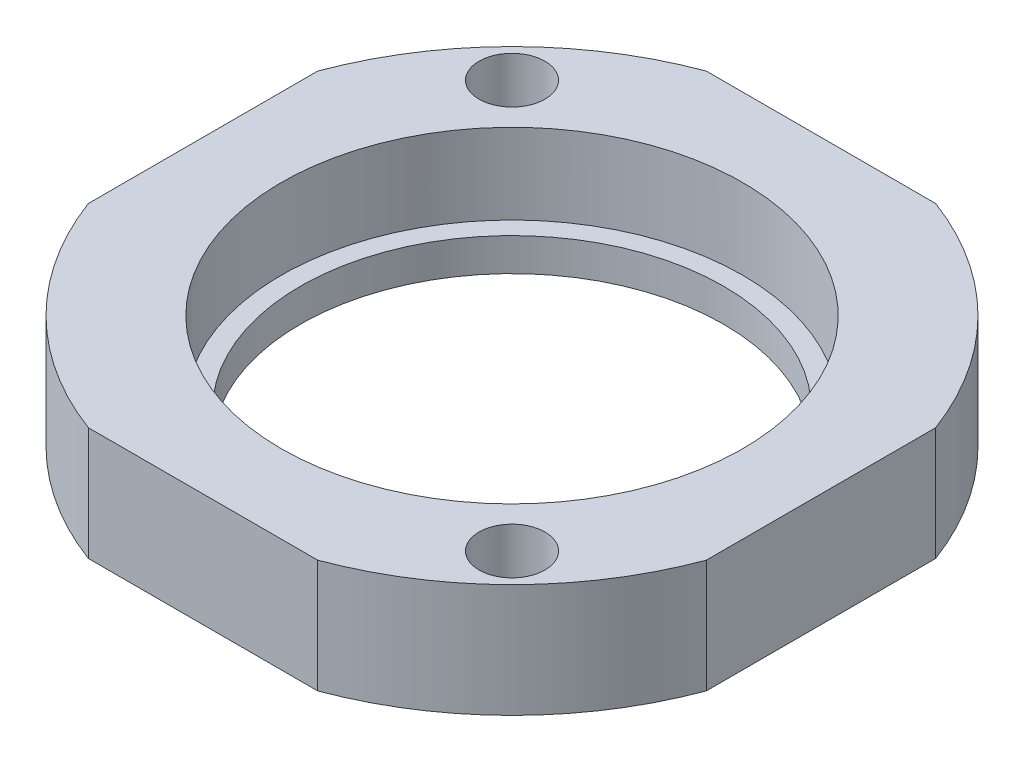
ISO-10303-21;
HEADER;
FILE_DESCRIPTION(('STEP AP214'),'2;1');
FILE_NAME('part.step','',(''),(''),'','','');
FILE_SCHEMA(('AUTOMOTIVE_DESIGN { 1 0 10303 214 1 1 1 1 }'));
ENDSEC;
DATA;
#1=APPLICATION_CONTEXT('core data for automotive mechanical design processes');
#2=APPLICATION_PROTOCOL_DEFINITION('international standard','automotive_design',2000,#1);
#3=PRODUCT_CONTEXT('',#1,'mechanical');
#4=PRODUCT('Part','Part','',(#3));
#5=PRODUCT_RELATED_PRODUCT_CATEGORY('part','',(#4));
#6=PRODUCT_DEFINITION_FORMATION('','',#4);
#7=PRODUCT_DEFINITION_CONTEXT('part definition',#1,'design');
#8=PRODUCT_DEFINITION('design','',#6,#7);
#9=PRODUCT_DEFINITION_SHAPE('','',#8);
#10=(LENGTH_UNIT() NAMED_UNIT(*) SI_UNIT(.MILLI.,.METRE.));
#11=(NAMED_UNIT(*) PLANE_ANGLE_UNIT() SI_UNIT($,.RADIAN.));
#12=(NAMED_UNIT(*) SI_UNIT($,.STERADIAN.) SOLID_ANGLE_UNIT());
#13=UNCERTAINTY_MEASURE_WITH_UNIT(LENGTH_MEASURE(1.E-05),#10,'distance_accuracy_value','');
#14=(GEOMETRIC_REPRESENTATION_CONTEXT(3) GLOBAL_UNCERTAINTY_ASSIGNED_CONTEXT((#13)) GLOBAL_UNIT_ASSIGNED_CONTEXT((#10,
#11,#12)) REPRESENTATION_CONTEXT('',''));
#15=CARTESIAN_POINT('',(0.,0.,0.));
#16=DIRECTION('',(0.,0.,1.));
#17=DIRECTION('',(1.,0.,0.));
#18=AXIS2_PLACEMENT_3D('',#15,#16,#17);
#19=CARTESIAN_POINT('',(0.,-5.5,0.));
#20=DIRECTION('',(0.,1.,0.));
#21=DIRECTION('',(0.,0.,1.));
#22=AXIS2_PLACEMENT_3D('',#19,#20,#21);
#23=CYLINDRICAL_SURFACE('',#22,11.2);
#24=CARTESIAN_POINT('',(0.,0.,0.));
#25=DIRECTION('',(0.,1.,0.));
#26=DIRECTION('',(0.,0.,1.));
#27=AXIS2_PLACEMENT_3D('',#24,#25,#26);
#28=CIRCLE('',#27,11.2);
#29=CARTESIAN_POINT('',(0.,0.,11.2));
#30=VERTEX_POINT('',#29);
#31=EDGE_CURVE('E146',#30,#30,#28,.T.);
#32=ORIENTED_EDGE('',*,*,#31,.T.);
#33=EDGE_LOOP('',(#32));
#34=FACE_BOUND('',#33,.T.);
#35=CARTESIAN_POINT('',(0.,-3.9,0.));
#36=DIRECTION('',(0.,-1.,0.));
#37=DIRECTION('',(0.,0.,-1.));
#38=AXIS2_PLACEMENT_3D('',#35,#36,#37);
#39=CIRCLE('',#38,11.2);
#40=CARTESIAN_POINT('',(0.,-3.9,-11.2));
#41=VERTEX_POINT('',#40);
#42=EDGE_CURVE('E11',#41,#41,#39,.F.);
#43=ORIENTED_EDGE('',*,*,#42,.F.);
#44=EDGE_LOOP('',(#43));
#45=FACE_BOUND('',#44,.T.);
#46=ADVANCED_FACE('F37',(#34,#45),#23,.F.);
#47=CARTESIAN_POINT('',(0.,-5.5,15.));
#48=DIRECTION('',(0.,0.,-1.));
#49=DIRECTION('',(-1.,0.,0.));
#50=AXIS2_PLACEMENT_3D('',#47,#48,#49);
#51=PLANE('',#50);
#52=DIRECTION('',(-1.,0.,0.));
#53=VECTOR('',#52,1.);
#54=CARTESIAN_POINT('',(0.,0.,15.));
#55=LINE('',#54,#53);
#56=CARTESIAN_POINT('',(5.56776436283002,0.,15.));
#57=VERTEX_POINT('',#56);
#58=CARTESIAN_POINT('',(-5.56776436283001,0.,15.));
#59=VERTEX_POINT('',#58);
#60=EDGE_CURVE('E149',#57,#59,#55,.T.);
#61=ORIENTED_EDGE('',*,*,#60,.T.);
#62=DIRECTION('',(0.,1.,0.));
#63=VECTOR('',#62,1.);
#64=CARTESIAN_POINT('',(-5.56776436283001,-5.5,15.));
#65=LINE('',#64,#63);
#66=CARTESIAN_POINT('',(-5.56776436283001,-5.5,15.));
#67=VERTEX_POINT('',#66);
#68=EDGE_CURVE('E46',#67,#59,#65,.T.);
#69=ORIENTED_EDGE('',*,*,#68,.F.);
#70=DIRECTION('',(-1.,0.,0.));
#71=VECTOR('',#70,1.);
#72=CARTESIAN_POINT('',(0.,-5.5,15.));
#73=LINE('',#72,#71);
#74=CARTESIAN_POINT('',(5.56776436283002,-5.5,15.));
#75=VERTEX_POINT('',#74);
#76=EDGE_CURVE('E54',#75,#67,#73,.T.);
#77=ORIENTED_EDGE('',*,*,#76,.F.);
#78=DIRECTION('',(0.,1.,0.));
#79=VECTOR('',#78,1.);
#80=CARTESIAN_POINT('',(5.56776436283002,-5.5,15.));
#81=LINE('',#80,#79);
#82=EDGE_CURVE('E97',#75,#57,#81,.T.);
#83=ORIENTED_EDGE('',*,*,#82,.T.);
#84=EDGE_LOOP('',(#61,#69,#77,#83));
#85=FACE_BOUND('',#84,.T.);
#86=ADVANCED_FACE('F39',(#85),#51,.F.);
#87=CARTESIAN_POINT('',(0.,-5.5,0.));
#88=DIRECTION('',(0.,1.,0.));
#89=DIRECTION('',(0.,0.,1.));
#90=AXIS2_PLACEMENT_3D('',#87,#88,#89);
#91=CYLINDRICAL_SURFACE('',#90,16.);
#92=CARTESIAN_POINT('',(0.,0.,0.));
#93=DIRECTION('',(0.,1.,0.));
#94=DIRECTION('',(0.,0.,1.));
#95=AXIS2_PLACEMENT_3D('',#92,#93,#94);
#96=CIRCLE('',#95,16.);
#97=CARTESIAN_POINT('',(-15.,0.,5.56776436283002));
#98=VERTEX_POINT('',#97);
#99=EDGE_CURVE('E140',#98,#59,#96,.T.);
#100=ORIENTED_EDGE('',*,*,#99,.F.);
#101=DIRECTION('',(0.,1.,0.));
#102=VECTOR('',#101,1.);
#103=CARTESIAN_POINT('',(-15.,-5.5,5.56776436283002));
#104=LINE('',#103,#102);
#105=CARTESIAN_POINT('',(-15.,-5.5,5.56776436283002));
#106=VERTEX_POINT('',#105);
#107=EDGE_CURVE('E83',#106,#98,#104,.T.);
#108=ORIENTED_EDGE('',*,*,#107,.F.);
#109=CARTESIAN_POINT('',(0.,-5.5,0.));
#110=DIRECTION('',(0.,1.,0.));
#111=DIRECTION('',(0.,0.,1.));
#112=AXIS2_PLACEMENT_3D('',#109,#110,#111);
#113=CIRCLE('',#112,16.);
#114=EDGE_CURVE('E127',#106,#67,#113,.T.);
#115=ORIENTED_EDGE('',*,*,#114,.T.);
#116=ORIENTED_EDGE('',*,*,#68,.T.);
#117=EDGE_LOOP('',(#100,#108,#115,#116));
#118=FACE_BOUND('',#117,.T.);
#119=ADVANCED_FACE('F193',(#118),#91,.T.);
#120=CARTESIAN_POINT('',(-15.,-5.5,0.));
#121=DIRECTION('',(-1.,0.,0.));
#122=DIRECTION('',(0.,0.,1.));
#123=AXIS2_PLACEMENT_3D('',#120,#121,#122);
#124=PLANE('',#123);
#125=DIRECTION('',(0.,0.,1.));
#126=VECTOR('',#125,1.);
#127=CARTESIAN_POINT('',(-15.,0.,0.));
#128=LINE('',#127,#126);
#129=CARTESIAN_POINT('',(-15.,0.,-5.56776436283002));
#130=VERTEX_POINT('',#129);
#131=EDGE_CURVE('E114',#130,#98,#128,.T.);
#132=ORIENTED_EDGE('',*,*,#131,.F.);
#133=DIRECTION('',(0.,1.,0.));
#134=VECTOR('',#133,1.);
#135=CARTESIAN_POINT('',(-15.,-5.5,-5.56776436283002));
#136=LINE('',#135,#134);
#137=CARTESIAN_POINT('',(-15.,-5.5,-5.56776436283002));
#138=VERTEX_POINT('',#137);
#139=EDGE_CURVE('E110',#138,#130,#136,.T.);
#140=ORIENTED_EDGE('',*,*,#139,.F.);
#141=DIRECTION('',(0.,0.,1.));
#142=VECTOR('',#141,1.);
#143=CARTESIAN_POINT('',(-15.,-5.5,0.));
#144=LINE('',#143,#142);
#145=EDGE_CURVE('E113',#138,#106,#144,.T.);
#146=ORIENTED_EDGE('',*,*,#145,.T.);
#147=ORIENTED_EDGE('',*,*,#107,.T.);
#148=EDGE_LOOP('',(#132,#140,#146,#147));
#149=FACE_BOUND('',#148,.T.);
#150=ADVANCED_FACE('F112',(#149),#124,.T.);
#151=CARTESIAN_POINT('',(-5.56776436283002,0.,-15.));
#152=VERTEX_POINT('',#151);
#153=EDGE_CURVE('E143',#152,#130,#96,.T.);
#154=ORIENTED_EDGE('',*,*,#153,.F.);
#155=DIRECTION('',(0.,1.,0.));
#156=VECTOR('',#155,1.);
#157=CARTESIAN_POINT('',(-5.56776436283002,-5.5,-15.));
#158=LINE('',#157,#156);
#159=CARTESIAN_POINT('',(-5.56776436283002,-5.5,-15.));
#160=VERTEX_POINT('',#159);
#161=EDGE_CURVE('E119',#160,#152,#158,.T.);
#162=ORIENTED_EDGE('',*,*,#161,.F.);
#163=EDGE_CURVE('E125',#160,#138,#113,.T.);
#164=ORIENTED_EDGE('',*,*,#163,.T.);
#165=ORIENTED_EDGE('',*,*,#139,.T.);
#166=EDGE_LOOP('',(#154,#162,#164,#165));
#167=FACE_BOUND('',#166,.T.);
#168=ADVANCED_FACE('F129',(#167),#91,.T.);
#169=CARTESIAN_POINT('',(0.,-5.5,-15.));
#170=DIRECTION('',(0.,0.,-1.));
#171=DIRECTION('',(-1.,0.,0.));
#172=AXIS2_PLACEMENT_3D('',#169,#170,#171);
#173=PLANE('',#172);
#174=DIRECTION('',(-1.,0.,0.));
#175=VECTOR('',#174,1.);
#176=CARTESIAN_POINT('',(0.,0.,-15.));
#177=LINE('',#176,#175);
#178=CARTESIAN_POINT('',(5.56776436283002,0.,-15.));
#179=VERTEX_POINT('',#178);
#180=EDGE_CURVE('E299',#179,#152,#177,.T.);
#181=ORIENTED_EDGE('',*,*,#180,.F.);
#182=DIRECTION('',(0.,1.,0.));
#183=VECTOR('',#182,1.);
#184=CARTESIAN_POINT('',(5.56776436283002,-5.5,-15.));
#185=LINE('',#184,#183);
#186=CARTESIAN_POINT('',(5.56776436283002,-5.5,-15.));
#187=VERTEX_POINT('',#186);
#188=EDGE_CURVE('E307',#187,#179,#185,.T.);
#189=ORIENTED_EDGE('',*,*,#188,.F.);
#190=DIRECTION('',(-1.,0.,0.));
#191=VECTOR('',#190,1.);
#192=CARTESIAN_POINT('',(0.,-5.5,-15.));
#193=LINE('',#192,#191);
#194=EDGE_CURVE('E130',#187,#160,#193,.T.);
#195=ORIENTED_EDGE('',*,*,#194,.T.);
#196=ORIENTED_EDGE('',*,*,#161,.T.);
#197=EDGE_LOOP('',(#181,#189,#195,#196));
#198=FACE_BOUND('',#197,.T.);
#199=ADVANCED_FACE('F253',(#198),#173,.T.);
#200=CARTESIAN_POINT('',(15.,0.,-5.56776436283004));
#201=VERTEX_POINT('',#200);
#202=EDGE_CURVE('E300',#201,#179,#96,.T.);
#203=ORIENTED_EDGE('',*,*,#202,.F.);
#204=DIRECTION('',(0.,1.,0.));
#205=VECTOR('',#204,1.);
#206=CARTESIAN_POINT('',(15.,-5.5,-5.56776436283004));
#207=LINE('',#206,#205);
#208=CARTESIAN_POINT('',(15.,-5.5,-5.56776436283004));
#209=VERTEX_POINT('',#208);
#210=EDGE_CURVE('E309',#209,#201,#207,.T.);
#211=ORIENTED_EDGE('',*,*,#210,.F.);
#212=EDGE_CURVE('E132',#209,#187,#113,.T.);
#213=ORIENTED_EDGE('',*,*,#212,.T.);
#214=ORIENTED_EDGE('',*,*,#188,.T.);
#215=EDGE_LOOP('',(#203,#211,#213,#214));
#216=FACE_BOUND('',#215,.T.);
#217=ADVANCED_FACE('F192',(#216),#91,.T.);
#218=CARTESIAN_POINT('',(15.,-5.5,0.));
#219=DIRECTION('',(-1.,0.,0.));
#220=DIRECTION('',(0.,0.,1.));
#221=AXIS2_PLACEMENT_3D('',#218,#219,#220);
#222=PLANE('',#221);
#223=DIRECTION('',(0.,0.,1.));
#224=VECTOR('',#223,1.);
#225=CARTESIAN_POINT('',(15.,0.,0.));
#226=LINE('',#225,#224);
#227=CARTESIAN_POINT('',(15.,0.,5.56776436283003));
#228=VERTEX_POINT('',#227);
#229=EDGE_CURVE('E315',#201,#228,#226,.T.);
#230=ORIENTED_EDGE('',*,*,#229,.T.);
#231=DIRECTION('',(0.,1.,0.));
#232=VECTOR('',#231,1.);
#233=CARTESIAN_POINT('',(15.,-5.5,5.56776436283003));
#234=LINE('',#233,#232);
#235=CARTESIAN_POINT('',(15.,-5.5,5.56776436283003));
#236=VERTEX_POINT('',#235);
#237=EDGE_CURVE('E139',#236,#228,#234,.T.);
#238=ORIENTED_EDGE('',*,*,#237,.F.);
#239=DIRECTION('',(0.,0.,1.));
#240=VECTOR('',#239,1.);
#241=CARTESIAN_POINT('',(15.,-5.5,0.));
#242=LINE('',#241,#240);
#243=EDGE_CURVE('E138',#209,#236,#242,.T.);
#244=ORIENTED_EDGE('',*,*,#243,.F.);
#245=ORIENTED_EDGE('',*,*,#210,.T.);
#246=EDGE_LOOP('',(#230,#238,#244,#245));
#247=FACE_BOUND('',#246,.T.);
#248=ADVANCED_FACE('F190',(#247),#222,.F.);
#249=EDGE_CURVE('E144',#57,#228,#96,.T.);
#250=ORIENTED_EDGE('',*,*,#249,.F.);
#251=ORIENTED_EDGE('',*,*,#82,.F.);
#252=EDGE_CURVE('E134',#75,#236,#113,.T.);
#253=ORIENTED_EDGE('',*,*,#252,.T.);
#254=ORIENTED_EDGE('',*,*,#237,.T.);
#255=EDGE_LOOP('',(#250,#251,#253,#254));
#256=FACE_BOUND('',#255,.T.);
#257=ADVANCED_FACE('F180',(#256),#91,.T.);
#258=CARTESIAN_POINT('',(0.,-5.5,0.));
#259=DIRECTION('',(0.,1.,0.));
#260=DIRECTION('',(0.,0.,1.));
#261=AXIS2_PLACEMENT_3D('',#258,#259,#260);
#262=PLANE('',#261);
#263=CARTESIAN_POINT('',(-9.89949493661168,-5.5,-9.89949493661165));
#264=DIRECTION('',(0.,1.,0.));
#265=DIRECTION('',(0.,0.,1.));
#266=AXIS2_PLACEMENT_3D('',#263,#264,#265);
#267=CIRCLE('',#266,1.6);
#268=CARTESIAN_POINT('',(-9.89949493661168,-5.5,-8.29949493661164));
#269=VERTEX_POINT('',#268);
#270=EDGE_CURVE('E150',#269,#269,#267,.T.);
#271=ORIENTED_EDGE('',*,*,#270,.T.);
#272=EDGE_LOOP('',(#271));
#273=FACE_BOUND('',#272,.T.);
#274=CARTESIAN_POINT('',(9.89949493661161,-5.5,9.89949493661172));
#275=DIRECTION('',(0.,1.,0.));
#276=DIRECTION('',(0.,0.,1.));
#277=AXIS2_PLACEMENT_3D('',#274,#275,#276);
#278=CIRCLE('',#277,1.6);
#279=CARTESIAN_POINT('',(9.89949493661161,-5.5,11.4994949366117));
#280=VERTEX_POINT('',#279);
#281=EDGE_CURVE('E154',#280,#280,#278,.T.);
#282=ORIENTED_EDGE('',*,*,#281,.T.);
#283=EDGE_LOOP('',(#282));
#284=FACE_BOUND('',#283,.T.);
#285=ORIENTED_EDGE('',*,*,#76,.T.);
#286=ORIENTED_EDGE('',*,*,#114,.F.);
#287=ORIENTED_EDGE('',*,*,#145,.F.);
#288=ORIENTED_EDGE('',*,*,#163,.F.);
#289=ORIENTED_EDGE('',*,*,#194,.F.);
#290=ORIENTED_EDGE('',*,*,#212,.F.);
#291=ORIENTED_EDGE('',*,*,#243,.T.);
#292=ORIENTED_EDGE('',*,*,#252,.F.);
#293=EDGE_LOOP('',(#285,#286,#287,#288,#289,#290,#291,#292));
#294=FACE_BOUND('',#293,.T.);
#295=CARTESIAN_POINT('',(0.,-5.5,0.));
#296=DIRECTION('',(0.,-1.,0.));
#297=DIRECTION('',(0.,0.,-1.));
#298=AXIS2_PLACEMENT_3D('',#295,#296,#297);
#299=CIRCLE('',#298,10.275);
#300=CARTESIAN_POINT('',(0.,-5.5,-10.275));
#301=VERTEX_POINT('',#300);
#302=EDGE_CURVE('E163',#301,#301,#299,.T.);
#303=ORIENTED_EDGE('',*,*,#302,.F.);
#304=EDGE_LOOP('',(#303));
#305=FACE_BOUND('',#304,.T.);
#306=ADVANCED_FACE('F122',(#273,#284,#294,#305),#262,.F.);
#307=CARTESIAN_POINT('',(0.,0.,0.));
#308=DIRECTION('',(0.,1.,0.));
#309=DIRECTION('',(0.,0.,1.));
#310=AXIS2_PLACEMENT_3D('',#307,#308,#309);
#311=PLANE('',#310);
#312=CARTESIAN_POINT('',(-9.89949493661168,0.,-9.89949493661165));
#313=DIRECTION('',(0.,1.,0.));
#314=DIRECTION('',(0.,0.,1.));
#315=AXIS2_PLACEMENT_3D('',#312,#313,#314);
#316=CIRCLE('',#315,1.6);
#317=CARTESIAN_POINT('',(-9.89949493661168,0.,-8.29949493661164));
#318=VERTEX_POINT('',#317);
#319=EDGE_CURVE('E158',#318,#318,#316,.T.);
#320=ORIENTED_EDGE('',*,*,#319,.F.);
#321=EDGE_LOOP('',(#320));
#322=FACE_BOUND('',#321,.T.);
#323=CARTESIAN_POINT('',(9.89949493661161,0.,9.89949493661172));
#324=DIRECTION('',(0.,1.,0.));
#325=DIRECTION('',(0.,0.,1.));
#326=AXIS2_PLACEMENT_3D('',#323,#324,#325);
#327=CIRCLE('',#326,1.6);
#328=CARTESIAN_POINT('',(9.89949493661161,0.,11.4994949366117));
#329=VERTEX_POINT('',#328);
#330=EDGE_CURVE('E151',#329,#329,#327,.T.);
#331=ORIENTED_EDGE('',*,*,#330,.F.);
#332=EDGE_LOOP('',(#331));
#333=FACE_BOUND('',#332,.T.);
#334=ORIENTED_EDGE('',*,*,#31,.F.);
#335=EDGE_LOOP('',(#334));
#336=FACE_BOUND('',#335,.T.);
#337=ORIENTED_EDGE('',*,*,#60,.F.);
#338=ORIENTED_EDGE('',*,*,#249,.T.);
#339=ORIENTED_EDGE('',*,*,#229,.F.);
#340=ORIENTED_EDGE('',*,*,#202,.T.);
#341=ORIENTED_EDGE('',*,*,#180,.T.);
#342=ORIENTED_EDGE('',*,*,#153,.T.);
#343=ORIENTED_EDGE('',*,*,#131,.T.);
#344=ORIENTED_EDGE('',*,*,#99,.T.);
#345=EDGE_LOOP('',(#337,#338,#339,#340,#341,#342,#343,#344));
#346=FACE_BOUND('',#345,.T.);
#347=ADVANCED_FACE('F179',(#322,#333,#336,#346),#311,.T.);
#348=CARTESIAN_POINT('',(9.89949493661161,-5.5,9.89949493661172));
#349=DIRECTION('',(0.,1.,0.));
#350=DIRECTION('',(0.,0.,1.));
#351=AXIS2_PLACEMENT_3D('',#348,#349,#350);
#352=CYLINDRICAL_SURFACE('',#351,1.6);
#353=ORIENTED_EDGE('',*,*,#281,.F.);
#354=EDGE_LOOP('',(#353));
#355=FACE_BOUND('',#354,.T.);
#356=ORIENTED_EDGE('',*,*,#330,.T.);
#357=EDGE_LOOP('',(#356));
#358=FACE_BOUND('',#357,.T.);
#359=ADVANCED_FACE('F187',(#355,#358),#352,.F.);
#360=CARTESIAN_POINT('',(-9.89949493661168,-5.5,-9.89949493661165));
#361=DIRECTION('',(0.,1.,0.));
#362=DIRECTION('',(0.,0.,1.));
#363=AXIS2_PLACEMENT_3D('',#360,#361,#362);
#364=CYLINDRICAL_SURFACE('',#363,1.6);
#365=ORIENTED_EDGE('',*,*,#270,.F.);
#366=EDGE_LOOP('',(#365));
#367=FACE_BOUND('',#366,.T.);
#368=ORIENTED_EDGE('',*,*,#319,.T.);
#369=EDGE_LOOP('',(#368));
#370=FACE_BOUND('',#369,.T.);
#371=ADVANCED_FACE('F175',(#367,#370),#364,.F.);
#372=CARTESIAN_POINT('',(0.,-3.9,0.));
#373=DIRECTION('',(0.,-1.,0.));
#374=DIRECTION('',(0.,0.,-1.));
#375=AXIS2_PLACEMENT_3D('',#372,#373,#374);
#376=CYLINDRICAL_SURFACE('',#375,10.275);
#377=CARTESIAN_POINT('',(0.,-3.9,0.));
#378=DIRECTION('',(0.,-1.,0.));
#379=DIRECTION('',(0.,0.,-1.));
#380=AXIS2_PLACEMENT_3D('',#377,#378,#379);
#381=CIRCLE('',#380,10.275);
#382=CARTESIAN_POINT('',(0.,-3.9,-10.275));
#383=VERTEX_POINT('',#382);
#384=EDGE_CURVE('E155',#383,#383,#381,.T.);
#385=ORIENTED_EDGE('',*,*,#384,.F.);
#386=EDGE_LOOP('',(#385));
#387=FACE_BOUND('',#386,.T.);
#388=ORIENTED_EDGE('',*,*,#302,.T.);
#389=EDGE_LOOP('',(#388));
#390=FACE_BOUND('',#389,.T.);
#391=ADVANCED_FACE('F172',(#387,#390),#376,.F.);
#392=CARTESIAN_POINT('',(0.,-3.9,0.));
#393=DIRECTION('',(0.,-1.,0.));
#394=DIRECTION('',(0.,0.,-1.));
#395=AXIS2_PLACEMENT_3D('',#392,#393,#394);
#396=PLANE('',#395);
#397=ORIENTED_EDGE('',*,*,#384,.T.);
#398=EDGE_LOOP('',(#397));
#399=FACE_BOUND('',#398,.T.);
#400=ORIENTED_EDGE('',*,*,#42,.T.);
#401=EDGE_LOOP('',(#400));
#402=FACE_BOUND('',#401,.T.);
#403=ADVANCED_FACE('F169',(#399,#402),#396,.F.);
#404=CLOSED_SHELL('',(#46,#86,#119,#150,#168,#199,#217,#248,#257,#306,#347,#359,#371,#391,#403));
#405=MANIFOLD_SOLID_BREP('B2',#404);
#406=ADVANCED_BREP_SHAPE_REPRESENTATION('',(#18,#405),#14);
#407=SHAPE_DEFINITION_REPRESENTATION(#9,#406);
ENDSEC;
END-ISO-10303-21;
